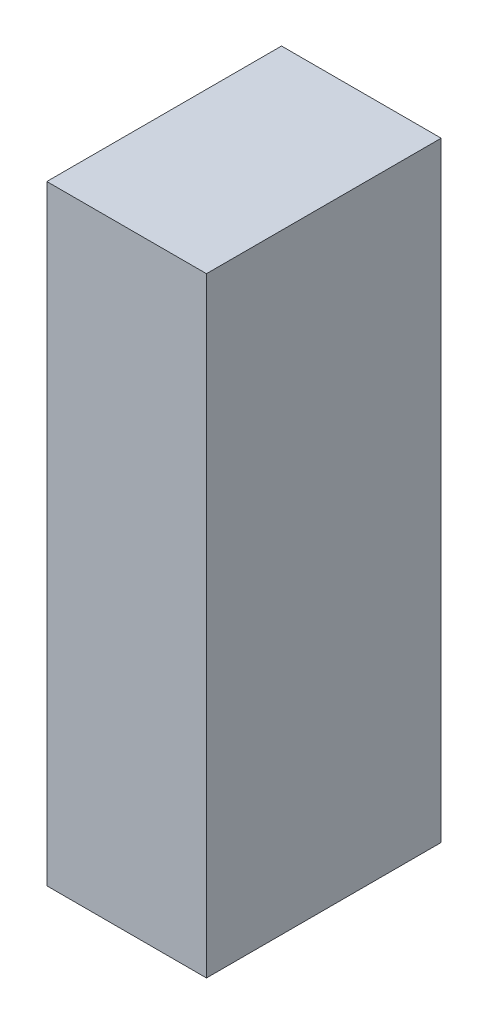
ISO-10303-21;
HEADER;
FILE_DESCRIPTION(('STEP AP214'),'2;1');
FILE_NAME('part.step','',(''),(''),'','','');
FILE_SCHEMA(('AUTOMOTIVE_DESIGN { 1 0 10303 214 1 1 1 1 }'));
ENDSEC;
DATA;
#1=APPLICATION_CONTEXT('core data for automotive mechanical design processes');
#2=APPLICATION_PROTOCOL_DEFINITION('international standard','automotive_design',2000,#1);
#3=PRODUCT_CONTEXT('',#1,'mechanical');
#4=PRODUCT('Part','Part','',(#3));
#5=PRODUCT_RELATED_PRODUCT_CATEGORY('part','',(#4));
#6=PRODUCT_DEFINITION_FORMATION('','',#4);
#7=PRODUCT_DEFINITION_CONTEXT('part definition',#1,'design');
#8=PRODUCT_DEFINITION('design','',#6,#7);
#9=PRODUCT_DEFINITION_SHAPE('','',#8);
#10=(LENGTH_UNIT() NAMED_UNIT(*) SI_UNIT(.MILLI.,.METRE.));
#11=(NAMED_UNIT(*) PLANE_ANGLE_UNIT() SI_UNIT($,.RADIAN.));
#12=(NAMED_UNIT(*) SI_UNIT($,.STERADIAN.) SOLID_ANGLE_UNIT());
#13=UNCERTAINTY_MEASURE_WITH_UNIT(LENGTH_MEASURE(1.E-05),#10,'distance_accuracy_value','');
#14=(GEOMETRIC_REPRESENTATION_CONTEXT(3) GLOBAL_UNCERTAINTY_ASSIGNED_CONTEXT((#13)) GLOBAL_UNIT_ASSIGNED_CONTEXT((#10,
#11,#12)) REPRESENTATION_CONTEXT('',''));
#15=CARTESIAN_POINT('',(0.,0.,0.));
#16=DIRECTION('',(0.,0.,1.));
#17=DIRECTION('',(1.,0.,0.));
#18=AXIS2_PLACEMENT_3D('',#15,#16,#17);
#19=CARTESIAN_POINT('',(0.,44.7,0.));
#20=DIRECTION('',(1.,0.,0.));
#21=DIRECTION('',(0.,0.,-1.));
#22=AXIS2_PLACEMENT_3D('',#19,#20,#21);
#23=PLANE('',#22);
#24=DIRECTION('',(0.,0.,1.));
#25=VECTOR('',#24,1.);
#26=CARTESIAN_POINT('',(0.,0.,0.));
#27=LINE('',#26,#25);
#28=CARTESIAN_POINT('',(0.,0.,-17.2));
#29=VERTEX_POINT('',#28);
#30=CARTESIAN_POINT('',(0.,0.,0.));
#31=VERTEX_POINT('',#30);
#32=EDGE_CURVE('E113',#29,#31,#27,.T.);
#33=ORIENTED_EDGE('',*,*,#32,.T.);
#34=DIRECTION('',(0.,-1.,0.));
#35=VECTOR('',#34,1.);
#36=CARTESIAN_POINT('',(0.,44.7,0.));
#37=LINE('',#36,#35);
#38=CARTESIAN_POINT('',(0.,44.7,0.));
#39=VERTEX_POINT('',#38);
#40=EDGE_CURVE('E11',#39,#31,#37,.T.);
#41=ORIENTED_EDGE('',*,*,#40,.F.);
#42=DIRECTION('',(0.,0.,1.));
#43=VECTOR('',#42,1.);
#44=CARTESIAN_POINT('',(0.,44.7,0.));
#45=LINE('',#44,#43);
#46=CARTESIAN_POINT('',(0.,44.7,-17.2));
#47=VERTEX_POINT('',#46);
#48=EDGE_CURVE('E97',#47,#39,#45,.T.);
#49=ORIENTED_EDGE('',*,*,#48,.F.);
#50=DIRECTION('',(0.,-1.,0.));
#51=VECTOR('',#50,1.);
#52=CARTESIAN_POINT('',(0.,44.7,-17.2));
#53=LINE('',#52,#51);
#54=EDGE_CURVE('E109',#47,#29,#53,.T.);
#55=ORIENTED_EDGE('',*,*,#54,.T.);
#56=EDGE_LOOP('',(#33,#41,#49,#55));
#57=FACE_BOUND('',#56,.T.);
#58=ADVANCED_FACE('F45',(#57),#23,.F.);
#59=CARTESIAN_POINT('',(0.,44.7,0.));
#60=DIRECTION('',(0.,0.,-1.));
#61=DIRECTION('',(-1.,0.,0.));
#62=AXIS2_PLACEMENT_3D('',#59,#60,#61);
#63=PLANE('',#62);
#64=DIRECTION('',(1.,0.,0.));
#65=VECTOR('',#64,1.);
#66=CARTESIAN_POINT('',(0.,0.,0.));
#67=LINE('',#66,#65);
#68=CARTESIAN_POINT('',(11.7,0.,0.));
#69=VERTEX_POINT('',#68);
#70=EDGE_CURVE('E102',#31,#69,#67,.T.);
#71=ORIENTED_EDGE('',*,*,#70,.T.);
#72=DIRECTION('',(0.,-1.,0.));
#73=VECTOR('',#72,1.);
#74=CARTESIAN_POINT('',(11.7,44.7,0.));
#75=LINE('',#74,#73);
#76=CARTESIAN_POINT('',(11.7,44.7,0.));
#77=VERTEX_POINT('',#76);
#78=EDGE_CURVE('E54',#77,#69,#75,.T.);
#79=ORIENTED_EDGE('',*,*,#78,.F.);
#80=DIRECTION('',(1.,0.,0.));
#81=VECTOR('',#80,1.);
#82=CARTESIAN_POINT('',(0.,44.7,0.));
#83=LINE('',#82,#81);
#84=EDGE_CURVE('E92',#39,#77,#83,.T.);
#85=ORIENTED_EDGE('',*,*,#84,.F.);
#86=ORIENTED_EDGE('',*,*,#40,.T.);
#87=EDGE_LOOP('',(#71,#79,#85,#86));
#88=FACE_BOUND('',#87,.T.);
#89=ADVANCED_FACE('F101',(#88),#63,.F.);
#90=CARTESIAN_POINT('',(11.7,44.7,0.));
#91=DIRECTION('',(-1.,0.,0.));
#92=DIRECTION('',(0.,0.,1.));
#93=AXIS2_PLACEMENT_3D('',#90,#91,#92);
#94=PLANE('',#93);
#95=DIRECTION('',(0.,0.,-1.));
#96=VECTOR('',#95,1.);
#97=CARTESIAN_POINT('',(11.7,0.,0.));
#98=LINE('',#97,#96);
#99=CARTESIAN_POINT('',(11.7,0.,-17.2));
#100=VERTEX_POINT('',#99);
#101=EDGE_CURVE('E79',#69,#100,#98,.T.);
#102=ORIENTED_EDGE('',*,*,#101,.T.);
#103=DIRECTION('',(0.,-1.,0.));
#104=VECTOR('',#103,1.);
#105=CARTESIAN_POINT('',(11.7,44.7,-17.2));
#106=LINE('',#105,#104);
#107=CARTESIAN_POINT('',(11.7,44.7,-17.2));
#108=VERTEX_POINT('',#107);
#109=EDGE_CURVE('E104',#108,#100,#106,.T.);
#110=ORIENTED_EDGE('',*,*,#109,.F.);
#111=DIRECTION('',(0.,0.,-1.));
#112=VECTOR('',#111,1.);
#113=CARTESIAN_POINT('',(11.7,44.7,0.));
#114=LINE('',#113,#112);
#115=EDGE_CURVE('E95',#77,#108,#114,.T.);
#116=ORIENTED_EDGE('',*,*,#115,.F.);
#117=ORIENTED_EDGE('',*,*,#78,.T.);
#118=EDGE_LOOP('',(#102,#110,#116,#117));
#119=FACE_BOUND('',#118,.T.);
#120=ADVANCED_FACE('F105',(#119),#94,.F.);
#121=CARTESIAN_POINT('',(0.,44.7,-17.2));
#122=DIRECTION('',(0.,0.,1.));
#123=DIRECTION('',(1.,0.,0.));
#124=AXIS2_PLACEMENT_3D('',#121,#122,#123);
#125=PLANE('',#124);
#126=DIRECTION('',(-1.,0.,0.));
#127=VECTOR('',#126,1.);
#128=CARTESIAN_POINT('',(0.,0.,-17.2));
#129=LINE('',#128,#127);
#130=EDGE_CURVE('E85',#100,#29,#129,.T.);
#131=ORIENTED_EDGE('',*,*,#130,.T.);
#132=ORIENTED_EDGE('',*,*,#54,.F.);
#133=DIRECTION('',(-1.,0.,0.));
#134=VECTOR('',#133,1.);
#135=CARTESIAN_POINT('',(0.,44.7,-17.2));
#136=LINE('',#135,#134);
#137=EDGE_CURVE('E62',#108,#47,#136,.T.);
#138=ORIENTED_EDGE('',*,*,#137,.F.);
#139=ORIENTED_EDGE('',*,*,#109,.T.);
#140=EDGE_LOOP('',(#131,#132,#138,#139));
#141=FACE_BOUND('',#140,.T.);
#142=ADVANCED_FACE('F126',(#141),#125,.F.);
#143=CARTESIAN_POINT('',(0.,44.7,0.));
#144=DIRECTION('',(0.,-1.,0.));
#145=DIRECTION('',(0.,0.,-1.));
#146=AXIS2_PLACEMENT_3D('',#143,#144,#145);
#147=PLANE('',#146);
#148=ORIENTED_EDGE('',*,*,#48,.T.);
#149=ORIENTED_EDGE('',*,*,#84,.T.);
#150=ORIENTED_EDGE('',*,*,#115,.T.);
#151=ORIENTED_EDGE('',*,*,#137,.T.);
#152=EDGE_LOOP('',(#148,#149,#150,#151));
#153=FACE_BOUND('',#152,.T.);
#154=ADVANCED_FACE('F93',(#153),#147,.F.);
#155=CARTESIAN_POINT('',(0.,0.,0.));
#156=DIRECTION('',(0.,-1.,0.));
#157=DIRECTION('',(0.,0.,-1.));
#158=AXIS2_PLACEMENT_3D('',#155,#156,#157);
#159=PLANE('',#158);
#160=ORIENTED_EDGE('',*,*,#32,.F.);
#161=ORIENTED_EDGE('',*,*,#130,.F.);
#162=ORIENTED_EDGE('',*,*,#101,.F.);
#163=ORIENTED_EDGE('',*,*,#70,.F.);
#164=EDGE_LOOP('',(#160,#161,#162,#163));
#165=FACE_BOUND('',#164,.T.);
#166=ADVANCED_FACE('F129',(#165),#159,.T.);
#167=CLOSED_SHELL('',(#58,#89,#120,#142,#154,#166));
#168=MANIFOLD_SOLID_BREP('B2',#167);
#169=ADVANCED_BREP_SHAPE_REPRESENTATION('',(#18,#168),#14);
#170=SHAPE_DEFINITION_REPRESENTATION(#9,#169);
ENDSEC;
END-ISO-10303-21;
